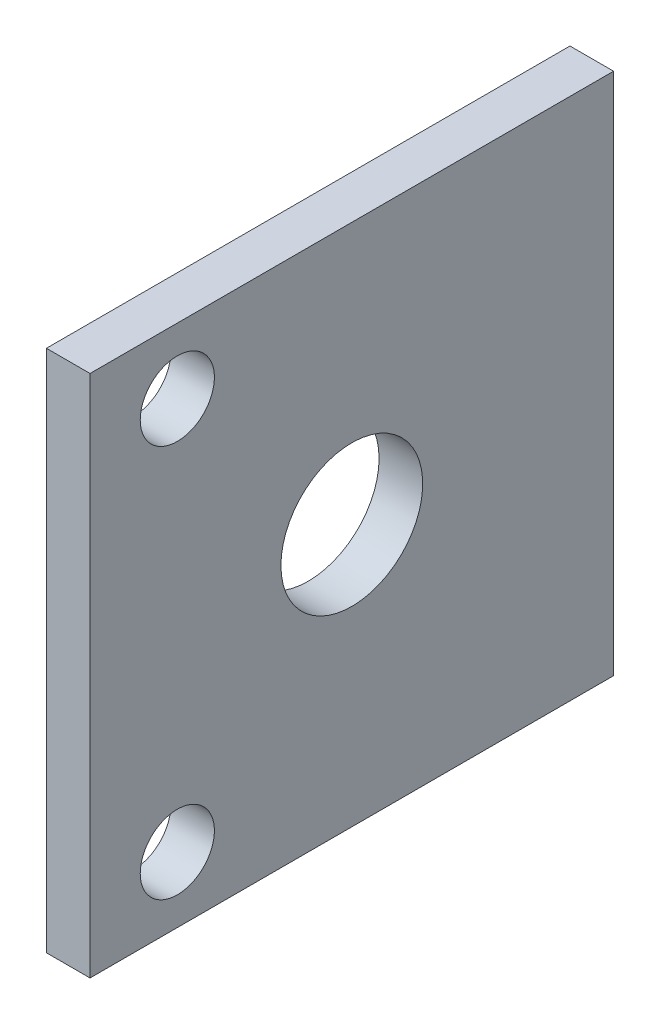
ISO-10303-21;
HEADER;
FILE_DESCRIPTION(('STEP AP214'),'2;1');
FILE_NAME('part.step','',(''),(''),'','','');
FILE_SCHEMA(('AUTOMOTIVE_DESIGN { 1 0 10303 214 1 1 1 1 }'));
ENDSEC;
DATA;
#1=APPLICATION_CONTEXT('core data for automotive mechanical design processes');
#2=APPLICATION_PROTOCOL_DEFINITION('international standard','automotive_design',2000,#1);
#3=PRODUCT_CONTEXT('',#1,'mechanical');
#4=PRODUCT('Part','Part','',(#3));
#5=PRODUCT_RELATED_PRODUCT_CATEGORY('part','',(#4));
#6=PRODUCT_DEFINITION_FORMATION('','',#4);
#7=PRODUCT_DEFINITION_CONTEXT('part definition',#1,'design');
#8=PRODUCT_DEFINITION('design','',#6,#7);
#9=PRODUCT_DEFINITION_SHAPE('','',#8);
#10=(LENGTH_UNIT() NAMED_UNIT(*) SI_UNIT(.MILLI.,.METRE.));
#11=(NAMED_UNIT(*) PLANE_ANGLE_UNIT() SI_UNIT($,.RADIAN.));
#12=(NAMED_UNIT(*) SI_UNIT($,.STERADIAN.) SOLID_ANGLE_UNIT());
#13=UNCERTAINTY_MEASURE_WITH_UNIT(LENGTH_MEASURE(1.E-05),#10,'distance_accuracy_value','');
#14=(GEOMETRIC_REPRESENTATION_CONTEXT(3) GLOBAL_UNCERTAINTY_ASSIGNED_CONTEXT((#13)) GLOBAL_UNIT_ASSIGNED_CONTEXT((#10,
#11,#12)) REPRESENTATION_CONTEXT('',''));
#15=CARTESIAN_POINT('',(0.,0.,0.));
#16=DIRECTION('',(0.,0.,1.));
#17=DIRECTION('',(1.,0.,0.));
#18=AXIS2_PLACEMENT_3D('',#15,#16,#17);
#19=CARTESIAN_POINT('',(13.,-17.,-7.5));
#20=DIRECTION('',(1.,0.,0.));
#21=DIRECTION('',(0.,0.,-1.));
#22=AXIS2_PLACEMENT_3D('',#19,#20,#21);
#23=PLANE('',#22);
#24=CARTESIAN_POINT('',(13.,-20.,-11.5));
#25=DIRECTION('',(1.,0.,0.));
#26=DIRECTION('',(0.,0.,-1.));
#27=AXIS2_PLACEMENT_3D('',#24,#25,#26);
#28=CIRCLE('',#27,1.7);
#29=CARTESIAN_POINT('',(13.,-20.,-13.2));
#30=VERTEX_POINT('',#29);
#31=EDGE_CURVE('E122',#30,#30,#28,.F.);
#32=ORIENTED_EDGE('',*,*,#31,.F.);
#33=EDGE_LOOP('',(#32));
#34=FACE_BOUND('',#33,.T.);
#35=CARTESIAN_POINT('',(13.,-38.,-11.5));
#36=DIRECTION('',(1.,0.,0.));
#37=DIRECTION('',(0.,0.,-1.));
#38=AXIS2_PLACEMENT_3D('',#35,#36,#37);
#39=CIRCLE('',#38,1.7);
#40=CARTESIAN_POINT('',(13.,-38.,-13.2));
#41=VERTEX_POINT('',#40);
#42=EDGE_CURVE('E117',#41,#41,#39,.F.);
#43=ORIENTED_EDGE('',*,*,#42,.F.);
#44=EDGE_LOOP('',(#43));
#45=FACE_BOUND('',#44,.T.);
#46=CARTESIAN_POINT('',(13.,-29.,-19.5));
#47=DIRECTION('',(1.,0.,0.));
#48=DIRECTION('',(0.,0.,-1.));
#49=AXIS2_PLACEMENT_3D('',#46,#47,#48);
#50=CIRCLE('',#49,3.25);
#51=CARTESIAN_POINT('',(13.,-29.,-22.75));
#52=VERTEX_POINT('',#51);
#53=EDGE_CURVE('E109',#52,#52,#50,.F.);
#54=ORIENTED_EDGE('',*,*,#53,.F.);
#55=EDGE_LOOP('',(#54));
#56=FACE_BOUND('',#55,.T.);
#57=DIRECTION('',(0.,-1.,0.));
#58=VECTOR('',#57,1.);
#59=CARTESIAN_POINT('',(13.,-17.,-31.5));
#60=LINE('',#59,#58);
#61=CARTESIAN_POINT('',(13.,-17.,-31.5));
#62=VERTEX_POINT('',#61);
#63=CARTESIAN_POINT('',(13.,-41.,-31.5));
#64=VERTEX_POINT('',#63);
#65=EDGE_CURVE('E110',#62,#64,#60,.T.);
#66=ORIENTED_EDGE('',*,*,#65,.T.);
#67=DIRECTION('',(0.,0.,-1.));
#68=VECTOR('',#67,1.);
#69=CARTESIAN_POINT('',(13.,-41.,-7.5));
#70=LINE('',#69,#68);
#71=CARTESIAN_POINT('',(13.,-41.,-7.5));
#72=VERTEX_POINT('',#71);
#73=EDGE_CURVE('E11',#72,#64,#70,.T.);
#74=ORIENTED_EDGE('',*,*,#73,.F.);
#75=DIRECTION('',(0.,-1.,0.));
#76=VECTOR('',#75,1.);
#77=CARTESIAN_POINT('',(13.,-17.,-7.5));
#78=LINE('',#77,#76);
#79=CARTESIAN_POINT('',(13.,-17.,-7.5));
#80=VERTEX_POINT('',#79);
#81=EDGE_CURVE('E93',#80,#72,#78,.T.);
#82=ORIENTED_EDGE('',*,*,#81,.F.);
#83=DIRECTION('',(0.,0.,-1.));
#84=VECTOR('',#83,1.);
#85=CARTESIAN_POINT('',(13.,-17.,-7.5));
#86=LINE('',#85,#84);
#87=EDGE_CURVE('E101',#80,#62,#86,.T.);
#88=ORIENTED_EDGE('',*,*,#87,.T.);
#89=EDGE_LOOP('',(#66,#74,#82,#88));
#90=FACE_BOUND('',#89,.T.);
#91=ADVANCED_FACE('F41',(#34,#45,#56,#90),#23,.F.);
#92=CARTESIAN_POINT('',(13.,-41.,-7.5));
#93=DIRECTION('',(0.,1.,0.));
#94=DIRECTION('',(0.,0.,1.));
#95=AXIS2_PLACEMENT_3D('',#92,#93,#94);
#96=PLANE('',#95);
#97=DIRECTION('',(1.,0.,0.));
#98=VECTOR('',#97,1.);
#99=CARTESIAN_POINT('',(13.,-41.,-31.5));
#100=LINE('',#99,#98);
#101=CARTESIAN_POINT('',(15.,-41.,-31.5));
#102=VERTEX_POINT('',#101);
#103=EDGE_CURVE('E96',#64,#102,#100,.T.);
#104=ORIENTED_EDGE('',*,*,#103,.T.);
#105=DIRECTION('',(0.,0.,-1.));
#106=VECTOR('',#105,1.);
#107=CARTESIAN_POINT('',(15.,-41.,-7.5));
#108=LINE('',#107,#106);
#109=CARTESIAN_POINT('',(15.,-41.,-7.5));
#110=VERTEX_POINT('',#109);
#111=EDGE_CURVE('E49',#110,#102,#108,.T.);
#112=ORIENTED_EDGE('',*,*,#111,.F.);
#113=DIRECTION('',(1.,0.,0.));
#114=VECTOR('',#113,1.);
#115=CARTESIAN_POINT('',(13.,-41.,-7.5));
#116=LINE('',#115,#114);
#117=EDGE_CURVE('E86',#72,#110,#116,.T.);
#118=ORIENTED_EDGE('',*,*,#117,.F.);
#119=ORIENTED_EDGE('',*,*,#73,.T.);
#120=EDGE_LOOP('',(#104,#112,#118,#119));
#121=FACE_BOUND('',#120,.T.);
#122=ADVANCED_FACE('F97',(#121),#96,.F.);
#123=CARTESIAN_POINT('',(15.,-41.,-7.5));
#124=DIRECTION('',(-1.,0.,0.));
#125=DIRECTION('',(0.,0.,1.));
#126=AXIS2_PLACEMENT_3D('',#123,#124,#125);
#127=PLANE('',#126);
#128=CARTESIAN_POINT('',(15.,-20.,-11.5));
#129=DIRECTION('',(-1.,0.,0.));
#130=DIRECTION('',(0.,0.,1.));
#131=AXIS2_PLACEMENT_3D('',#128,#129,#130);
#132=CIRCLE('',#131,1.7);
#133=CARTESIAN_POINT('',(15.,-20.,-9.8));
#134=VERTEX_POINT('',#133);
#135=EDGE_CURVE('E42',#134,#134,#132,.F.);
#136=ORIENTED_EDGE('',*,*,#135,.F.);
#137=EDGE_LOOP('',(#136));
#138=FACE_BOUND('',#137,.T.);
#139=CARTESIAN_POINT('',(15.,-38.,-11.5));
#140=DIRECTION('',(-1.,0.,0.));
#141=DIRECTION('',(0.,0.,1.));
#142=AXIS2_PLACEMENT_3D('',#139,#140,#141);
#143=CIRCLE('',#142,1.7);
#144=CARTESIAN_POINT('',(15.,-38.,-9.8));
#145=VERTEX_POINT('',#144);
#146=EDGE_CURVE('E118',#145,#145,#143,.F.);
#147=ORIENTED_EDGE('',*,*,#146,.F.);
#148=EDGE_LOOP('',(#147));
#149=FACE_BOUND('',#148,.T.);
#150=CARTESIAN_POINT('',(15.,-29.,-19.5));
#151=DIRECTION('',(-1.,0.,0.));
#152=DIRECTION('',(0.,0.,1.));
#153=AXIS2_PLACEMENT_3D('',#150,#151,#152);
#154=CIRCLE('',#153,3.25);
#155=CARTESIAN_POINT('',(15.,-29.,-16.25));
#156=VERTEX_POINT('',#155);
#157=EDGE_CURVE('E116',#156,#156,#154,.F.);
#158=ORIENTED_EDGE('',*,*,#157,.F.);
#159=EDGE_LOOP('',(#158));
#160=FACE_BOUND('',#159,.T.);
#161=DIRECTION('',(0.,1.,0.));
#162=VECTOR('',#161,1.);
#163=CARTESIAN_POINT('',(15.,-41.,-31.5));
#164=LINE('',#163,#162);
#165=CARTESIAN_POINT('',(15.,-17.,-31.5));
#166=VERTEX_POINT('',#165);
#167=EDGE_CURVE('E77',#102,#166,#164,.T.);
#168=ORIENTED_EDGE('',*,*,#167,.T.);
#169=DIRECTION('',(0.,0.,-1.));
#170=VECTOR('',#169,1.);
#171=CARTESIAN_POINT('',(15.,-17.,-7.5));
#172=LINE('',#171,#170);
#173=CARTESIAN_POINT('',(15.,-17.,-7.5));
#174=VERTEX_POINT('',#173);
#175=EDGE_CURVE('E100',#174,#166,#172,.T.);
#176=ORIENTED_EDGE('',*,*,#175,.F.);
#177=DIRECTION('',(0.,1.,0.));
#178=VECTOR('',#177,1.);
#179=CARTESIAN_POINT('',(15.,-41.,-7.5));
#180=LINE('',#179,#178);
#181=EDGE_CURVE('E95',#110,#174,#180,.T.);
#182=ORIENTED_EDGE('',*,*,#181,.F.);
#183=ORIENTED_EDGE('',*,*,#111,.T.);
#184=EDGE_LOOP('',(#168,#176,#182,#183));
#185=FACE_BOUND('',#184,.T.);
#186=ADVANCED_FACE('F103',(#138,#149,#160,#185),#127,.F.);
#187=CARTESIAN_POINT('',(15.,-17.,-7.5));
#188=DIRECTION('',(0.,-1.,0.));
#189=DIRECTION('',(0.,0.,-1.));
#190=AXIS2_PLACEMENT_3D('',#187,#188,#189);
#191=PLANE('',#190);
#192=DIRECTION('',(-1.,0.,0.));
#193=VECTOR('',#192,1.);
#194=CARTESIAN_POINT('',(15.,-17.,-31.5));
#195=LINE('',#194,#193);
#196=EDGE_CURVE('E85',#166,#62,#195,.T.);
#197=ORIENTED_EDGE('',*,*,#196,.T.);
#198=ORIENTED_EDGE('',*,*,#87,.F.);
#199=DIRECTION('',(-1.,0.,0.));
#200=VECTOR('',#199,1.);
#201=CARTESIAN_POINT('',(15.,-17.,-7.5));
#202=LINE('',#201,#200);
#203=EDGE_CURVE('E56',#174,#80,#202,.T.);
#204=ORIENTED_EDGE('',*,*,#203,.F.);
#205=ORIENTED_EDGE('',*,*,#175,.T.);
#206=EDGE_LOOP('',(#197,#198,#204,#205));
#207=FACE_BOUND('',#206,.T.);
#208=ADVANCED_FACE('F155',(#207),#191,.F.);
#209=CARTESIAN_POINT('',(0.,0.,-7.5));
#210=DIRECTION('',(0.,0.,1.));
#211=DIRECTION('',(1.,0.,0.));
#212=AXIS2_PLACEMENT_3D('',#209,#210,#211);
#213=PLANE('',#212);
#214=ORIENTED_EDGE('',*,*,#81,.T.);
#215=ORIENTED_EDGE('',*,*,#117,.T.);
#216=ORIENTED_EDGE('',*,*,#181,.T.);
#217=ORIENTED_EDGE('',*,*,#203,.T.);
#218=EDGE_LOOP('',(#214,#215,#216,#217));
#219=FACE_BOUND('',#218,.T.);
#220=ADVANCED_FACE('F88',(#219),#213,.T.);
#221=CARTESIAN_POINT('',(0.,0.,-31.5));
#222=DIRECTION('',(0.,0.,1.));
#223=DIRECTION('',(1.,0.,0.));
#224=AXIS2_PLACEMENT_3D('',#221,#222,#223);
#225=PLANE('',#224);
#226=ORIENTED_EDGE('',*,*,#65,.F.);
#227=ORIENTED_EDGE('',*,*,#196,.F.);
#228=ORIENTED_EDGE('',*,*,#167,.F.);
#229=ORIENTED_EDGE('',*,*,#103,.F.);
#230=EDGE_LOOP('',(#226,#227,#228,#229));
#231=FACE_BOUND('',#230,.T.);
#232=ADVANCED_FACE('F145',(#231),#225,.F.);
#233=CARTESIAN_POINT('',(15.1,-29.,-19.5));
#234=DIRECTION('',(-1.,0.,0.));
#235=DIRECTION('',(0.,0.,1.));
#236=AXIS2_PLACEMENT_3D('',#233,#234,#235);
#237=CYLINDRICAL_SURFACE('',#236,3.25);
#238=ORIENTED_EDGE('',*,*,#157,.T.);
#239=EDGE_LOOP('',(#238));
#240=FACE_BOUND('',#239,.T.);
#241=ORIENTED_EDGE('',*,*,#53,.T.);
#242=EDGE_LOOP('',(#241));
#243=FACE_BOUND('',#242,.T.);
#244=ADVANCED_FACE('F133',(#240,#243),#237,.F.);
#245=CARTESIAN_POINT('',(15.1,-38.,-11.5));
#246=DIRECTION('',(-1.,0.,0.));
#247=DIRECTION('',(0.,0.,1.));
#248=AXIS2_PLACEMENT_3D('',#245,#246,#247);
#249=CYLINDRICAL_SURFACE('',#248,1.7);
#250=ORIENTED_EDGE('',*,*,#146,.T.);
#251=EDGE_LOOP('',(#250));
#252=FACE_BOUND('',#251,.T.);
#253=ORIENTED_EDGE('',*,*,#42,.T.);
#254=EDGE_LOOP('',(#253));
#255=FACE_BOUND('',#254,.T.);
#256=ADVANCED_FACE('F146',(#252,#255),#249,.F.);
#257=CARTESIAN_POINT('',(15.1,-20.,-11.5));
#258=DIRECTION('',(-1.,0.,0.));
#259=DIRECTION('',(0.,0.,1.));
#260=AXIS2_PLACEMENT_3D('',#257,#258,#259);
#261=CYLINDRICAL_SURFACE('',#260,1.7);
#262=ORIENTED_EDGE('',*,*,#135,.T.);
#263=EDGE_LOOP('',(#262));
#264=FACE_BOUND('',#263,.T.);
#265=ORIENTED_EDGE('',*,*,#31,.T.);
#266=EDGE_LOOP('',(#265));
#267=FACE_BOUND('',#266,.T.);
#268=ADVANCED_FACE('F191',(#264,#267),#261,.F.);
#269=CLOSED_SHELL('',(#91,#122,#186,#208,#220,#232,#244,#256,#268));
#270=MANIFOLD_SOLID_BREP('B2',#269);
#271=ADVANCED_BREP_SHAPE_REPRESENTATION('',(#18,#270),#14);
#272=SHAPE_DEFINITION_REPRESENTATION(#9,#271);
ENDSEC;
END-ISO-10303-21;
